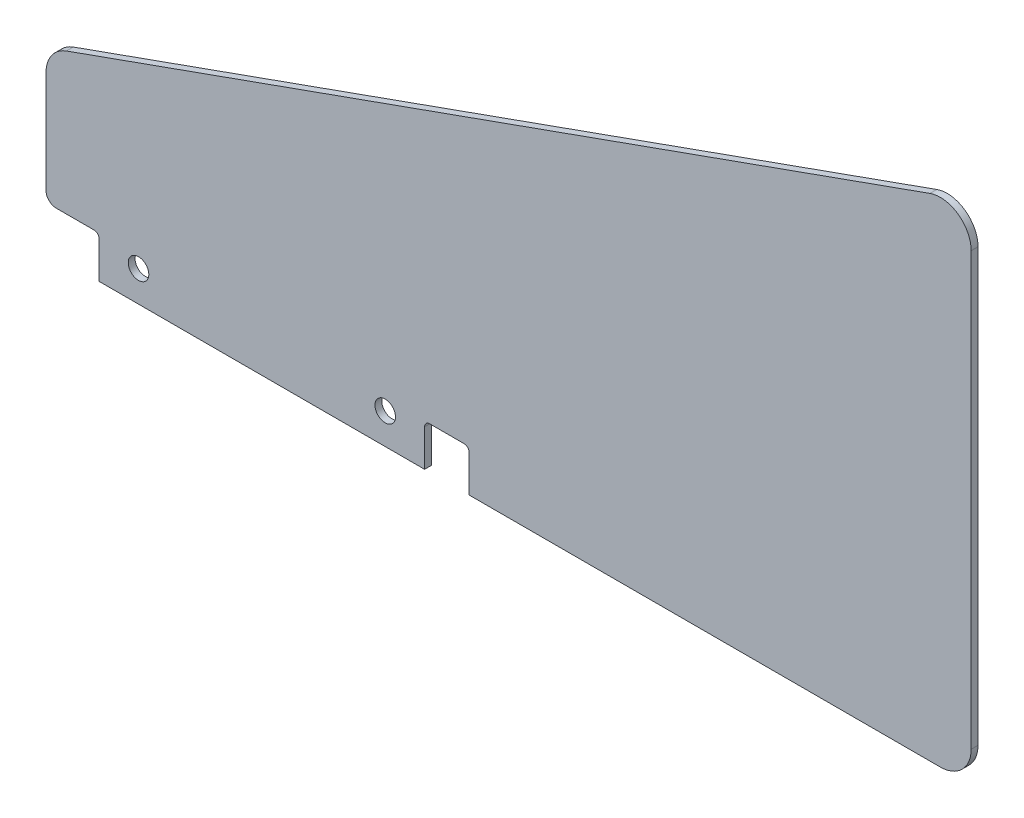
ISO-10303-21;
HEADER;
FILE_DESCRIPTION(('STEP AP214'),'2;1');
FILE_NAME('part.step','',(''),(''),'','','');
FILE_SCHEMA(('AUTOMOTIVE_DESIGN { 1 0 10303 214 1 1 1 1 }'));
ENDSEC;
DATA;
#1=APPLICATION_CONTEXT('core data for automotive mechanical design processes');
#2=APPLICATION_PROTOCOL_DEFINITION('international standard','automotive_design',2000,#1);
#3=PRODUCT_CONTEXT('',#1,'mechanical');
#4=PRODUCT('Part','Part','',(#3));
#5=PRODUCT_RELATED_PRODUCT_CATEGORY('part','',(#4));
#6=PRODUCT_DEFINITION_FORMATION('','',#4);
#7=PRODUCT_DEFINITION_CONTEXT('part definition',#1,'design');
#8=PRODUCT_DEFINITION('design','',#6,#7);
#9=PRODUCT_DEFINITION_SHAPE('','',#8);
#10=(LENGTH_UNIT() NAMED_UNIT(*) SI_UNIT(.MILLI.,.METRE.));
#11=(NAMED_UNIT(*) PLANE_ANGLE_UNIT() SI_UNIT($,.RADIAN.));
#12=(NAMED_UNIT(*) SI_UNIT($,.STERADIAN.) SOLID_ANGLE_UNIT());
#13=UNCERTAINTY_MEASURE_WITH_UNIT(LENGTH_MEASURE(1.E-05),#10,'distance_accuracy_value','');
#14=(GEOMETRIC_REPRESENTATION_CONTEXT(3) GLOBAL_UNCERTAINTY_ASSIGNED_CONTEXT((#13)) GLOBAL_UNIT_ASSIGNED_CONTEXT((#10,
#11,#12)) REPRESENTATION_CONTEXT('',''));
#15=CARTESIAN_POINT('',(0.,0.,0.));
#16=DIRECTION('',(0.,0.,1.));
#17=DIRECTION('',(1.,0.,0.));
#18=AXIS2_PLACEMENT_3D('',#15,#16,#17);
#19=CARTESIAN_POINT('',(216.1498900849,236.261881599726,1.));
#20=DIRECTION('',(0.,0.,1.));
#21=DIRECTION('',(1.,0.,0.));
#22=AXIS2_PLACEMENT_3D('',#19,#20,#21);
#23=PLANE('',#22);
#24=CARTESIAN_POINT('',(99.1498900849,173.2618815997,1.));
#25=DIRECTION('',(0.,0.,1.));
#26=DIRECTION('',(1.,0.,0.));
#27=AXIS2_PLACEMENT_3D('',#24,#25,#26);
#28=CIRCLE('',#27,1.5);
#29=CARTESIAN_POINT('',(100.6498900849,173.2618815997,1.));
#30=VERTEX_POINT('',#29);
#31=EDGE_CURVE('E188',#30,#30,#28,.T.);
#32=ORIENTED_EDGE('',*,*,#31,.F.);
#33=EDGE_LOOP('',(#32));
#34=FACE_BOUND('',#33,.T.);
#35=CARTESIAN_POINT('',(216.1498900849,236.261881599726,1.));
#36=DIRECTION('',(0.,0.,1.));
#37=DIRECTION('',(1.,0.,0.));
#38=AXIS2_PLACEMENT_3D('',#35,#36,#37);
#39=CIRCLE('',#38,4.5);
#40=CARTESIAN_POINT('',(220.6498900849,236.2618815997,1.));
#41=VERTEX_POINT('',#40);
#42=CARTESIAN_POINT('',(214.6363762984,240.4997202019,1.));
#43=VERTEX_POINT('',#42);
#44=EDGE_CURVE('E217',#41,#43,#39,.T.);
#45=ORIENTED_EDGE('',*,*,#44,.T.);
#46=DIRECTION('',(-0.941741911594838,-0.336336396998156,0.));
#47=VECTOR('',#46,1.);
#48=CARTESIAN_POINT('',(88.6363762984,195.4997202019,1.));
#49=LINE('',#48,#47);
#50=CARTESIAN_POINT('',(88.6363762984,195.4997202019,1.));
#51=VERTEX_POINT('',#50);
#52=EDGE_CURVE('E120',#43,#51,#49,.T.);
#53=ORIENTED_EDGE('',*,*,#52,.T.);
#54=CARTESIAN_POINT('',(90.1498900849,191.261881599726,1.));
#55=DIRECTION('',(0.,0.,1.));
#56=DIRECTION('',(1.,0.,0.));
#57=AXIS2_PLACEMENT_3D('',#54,#55,#56);
#58=CIRCLE('',#57,4.49999999999999);
#59=CARTESIAN_POINT('',(85.6498900849,191.2618815997,1.));
#60=VERTEX_POINT('',#59);
#61=EDGE_CURVE('E259',#51,#60,#58,.T.);
#62=ORIENTED_EDGE('',*,*,#61,.T.);
#63=DIRECTION('',(0.,-1.,0.));
#64=VECTOR('',#63,1.);
#65=CARTESIAN_POINT('',(85.6498900849,176.3868815997,1.));
#66=LINE('',#65,#64);
#67=CARTESIAN_POINT('',(85.6498900849,176.3868815997,1.));
#68=VERTEX_POINT('',#67);
#69=EDGE_CURVE('E278',#60,#68,#66,.T.);
#70=ORIENTED_EDGE('',*,*,#69,.T.);
#71=CARTESIAN_POINT('',(87.1498900849,176.3868815997,1.));
#72=DIRECTION('',(0.,0.,1.));
#73=DIRECTION('',(1.,0.,0.));
#74=AXIS2_PLACEMENT_3D('',#71,#72,#73);
#75=CIRCLE('',#74,1.5);
#76=CARTESIAN_POINT('',(87.1498900849,174.8868815997,1.));
#77=VERTEX_POINT('',#76);
#78=EDGE_CURVE('E275',#68,#77,#75,.T.);
#79=ORIENTED_EDGE('',*,*,#78,.T.);
#80=DIRECTION('',(1.,0.,0.));
#81=VECTOR('',#80,1.);
#82=CARTESIAN_POINT('',(87.1498900849,174.8868815997,1.));
#83=LINE('',#82,#81);
#84=CARTESIAN_POINT('',(92.6498900849,174.8868815997,1.));
#85=VERTEX_POINT('',#84);
#86=EDGE_CURVE('E277',#77,#85,#83,.T.);
#87=ORIENTED_EDGE('',*,*,#86,.T.);
#88=CARTESIAN_POINT('',(92.6498900849,174.1368815997,1.));
#89=DIRECTION('',(0.,0.,-1.));
#90=DIRECTION('',(1.,0.,0.));
#91=AXIS2_PLACEMENT_3D('',#88,#89,#90);
#92=CIRCLE('',#91,0.749999999999994);
#93=CARTESIAN_POINT('',(93.3998900849,174.1368815997,1.));
#94=VERTEX_POINT('',#93);
#95=EDGE_CURVE('E280',#85,#94,#92,.T.);
#96=ORIENTED_EDGE('',*,*,#95,.T.);
#97=DIRECTION('',(0.,-1.,0.));
#98=VECTOR('',#97,1.);
#99=CARTESIAN_POINT('',(93.3998900849,174.1368815997,1.));
#100=LINE('',#99,#98);
#101=CARTESIAN_POINT('',(93.3998900849,168.7618815997,1.));
#102=VERTEX_POINT('',#101);
#103=EDGE_CURVE('E286',#94,#102,#100,.T.);
#104=ORIENTED_EDGE('',*,*,#103,.T.);
#105=DIRECTION('',(1.,0.,0.));
#106=VECTOR('',#105,1.);
#107=CARTESIAN_POINT('',(93.3998900849,168.7618815997,1.));
#108=LINE('',#107,#106);
#109=CARTESIAN_POINT('',(140.8998900849,168.7618815997,1.));
#110=VERTEX_POINT('',#109);
#111=EDGE_CURVE('E288',#102,#110,#108,.T.);
#112=ORIENTED_EDGE('',*,*,#111,.T.);
#113=DIRECTION('',(0.,1.,0.));
#114=VECTOR('',#113,1.);
#115=CARTESIAN_POINT('',(140.8998900849,168.7618815997,1.));
#116=LINE('',#115,#114);
#117=CARTESIAN_POINT('',(140.8998900849,174.1368815997,1.));
#118=VERTEX_POINT('',#117);
#119=EDGE_CURVE('E290',#110,#118,#116,.T.);
#120=ORIENTED_EDGE('',*,*,#119,.T.);
#121=CARTESIAN_POINT('',(141.6498900849,174.1368815997,1.));
#122=DIRECTION('',(0.,0.,-1.));
#123=DIRECTION('',(1.,0.,0.));
#124=AXIS2_PLACEMENT_3D('',#121,#122,#123);
#125=CIRCLE('',#124,0.750000000000001);
#126=CARTESIAN_POINT('',(141.6498900849,174.8868815997,1.));
#127=VERTEX_POINT('',#126);
#128=EDGE_CURVE('E292',#118,#127,#125,.T.);
#129=ORIENTED_EDGE('',*,*,#128,.T.);
#130=DIRECTION('',(1.,0.,0.));
#131=VECTOR('',#130,1.);
#132=CARTESIAN_POINT('',(141.6498900849,174.8868815997,1.));
#133=LINE('',#132,#131);
#134=CARTESIAN_POINT('',(146.6498900849,174.8868815997,1.));
#135=VERTEX_POINT('',#134);
#136=EDGE_CURVE('E294',#127,#135,#133,.T.);
#137=ORIENTED_EDGE('',*,*,#136,.T.);
#138=CARTESIAN_POINT('',(146.6498900849,174.1368815997,1.));
#139=DIRECTION('',(0.,0.,-1.));
#140=DIRECTION('',(1.,0.,0.));
#141=AXIS2_PLACEMENT_3D('',#138,#139,#140);
#142=CIRCLE('',#141,0.750000000000001);
#143=CARTESIAN_POINT('',(147.3998900849,174.1368815997,1.));
#144=VERTEX_POINT('',#143);
#145=EDGE_CURVE('E296',#135,#144,#142,.T.);
#146=ORIENTED_EDGE('',*,*,#145,.T.);
#147=DIRECTION('',(0.,-1.,0.));
#148=VECTOR('',#147,1.);
#149=CARTESIAN_POINT('',(147.3998900849,174.1368815997,1.));
#150=LINE('',#149,#148);
#151=CARTESIAN_POINT('',(147.3998900849,168.7618815997,1.));
#152=VERTEX_POINT('',#151);
#153=EDGE_CURVE('E166',#144,#152,#150,.T.);
#154=ORIENTED_EDGE('',*,*,#153,.T.);
#155=DIRECTION('',(1.,0.,0.));
#156=VECTOR('',#155,1.);
#157=CARTESIAN_POINT('',(147.3998900849,168.7618815997,1.));
#158=LINE('',#157,#156);
#159=CARTESIAN_POINT('',(216.1498900849,168.7618815997,1.));
#160=VERTEX_POINT('',#159);
#161=EDGE_CURVE('E160',#152,#160,#158,.T.);
#162=ORIENTED_EDGE('',*,*,#161,.T.);
#163=CARTESIAN_POINT('',(216.1498900849,173.2618815997,1.));
#164=DIRECTION('',(0.,0.,1.));
#165=DIRECTION('',(1.,0.,0.));
#166=AXIS2_PLACEMENT_3D('',#163,#164,#165);
#167=CIRCLE('',#166,4.5);
#168=CARTESIAN_POINT('',(220.6498900849,173.2618815997,1.));
#169=VERTEX_POINT('',#168);
#170=EDGE_CURVE('E164',#160,#169,#167,.T.);
#171=ORIENTED_EDGE('',*,*,#170,.T.);
#172=DIRECTION('',(0.,1.,0.));
#173=VECTOR('',#172,1.);
#174=CARTESIAN_POINT('',(220.6498900849,236.2618815997,1.));
#175=LINE('',#174,#173);
#176=EDGE_CURVE('E50',#169,#41,#175,.T.);
#177=ORIENTED_EDGE('',*,*,#176,.T.);
#178=EDGE_LOOP('',(#45,#53,#62,#70,#79,#87,#96,#104,#112,#120,#129,#137,#146,#154,#162,#171,#177));
#179=FACE_BOUND('',#178,.T.);
#180=CARTESIAN_POINT('',(135.1498900849,173.2618815997,1.));
#181=DIRECTION('',(0.,0.,1.));
#182=DIRECTION('',(1.,0.,0.));
#183=AXIS2_PLACEMENT_3D('',#180,#181,#182);
#184=CIRCLE('',#183,1.5);
#185=CARTESIAN_POINT('',(136.6498900849,173.2618815997,1.));
#186=VERTEX_POINT('',#185);
#187=EDGE_CURVE('E339',#186,#186,#184,.T.);
#188=ORIENTED_EDGE('',*,*,#187,.F.);
#189=EDGE_LOOP('',(#188));
#190=FACE_BOUND('',#189,.T.);
#191=ADVANCED_FACE('F33',(#34,#179,#190),#23,.T.);
#192=CARTESIAN_POINT('',(216.1498900849,236.261881599726,0.));
#193=DIRECTION('',(0.,0.,1.));
#194=DIRECTION('',(1.,0.,0.));
#195=AXIS2_PLACEMENT_3D('',#192,#193,#194);
#196=PLANE('',#195);
#197=CARTESIAN_POINT('',(99.1498900849,173.2618815997,0.));
#198=DIRECTION('',(0.,0.,1.));
#199=DIRECTION('',(1.,0.,0.));
#200=AXIS2_PLACEMENT_3D('',#197,#198,#199);
#201=CIRCLE('',#200,1.5);
#202=CARTESIAN_POINT('',(100.6498900849,173.2618815997,0.));
#203=VERTEX_POINT('',#202);
#204=EDGE_CURVE('E344',#203,#203,#201,.T.);
#205=ORIENTED_EDGE('',*,*,#204,.T.);
#206=EDGE_LOOP('',(#205));
#207=FACE_BOUND('',#206,.T.);
#208=CARTESIAN_POINT('',(216.1498900849,236.261881599726,0.));
#209=DIRECTION('',(0.,0.,1.));
#210=DIRECTION('',(1.,0.,0.));
#211=AXIS2_PLACEMENT_3D('',#208,#209,#210);
#212=CIRCLE('',#211,4.5);
#213=CARTESIAN_POINT('',(220.6498900849,236.2618815997,0.));
#214=VERTEX_POINT('',#213);
#215=CARTESIAN_POINT('',(214.6363762984,240.4997202019,0.));
#216=VERTEX_POINT('',#215);
#217=EDGE_CURVE('E184',#214,#216,#212,.T.);
#218=ORIENTED_EDGE('',*,*,#217,.F.);
#219=DIRECTION('',(0.,1.,0.));
#220=VECTOR('',#219,1.);
#221=CARTESIAN_POINT('',(220.6498900849,236.2618815997,0.));
#222=LINE('',#221,#220);
#223=CARTESIAN_POINT('',(220.6498900849,173.2618815997,0.));
#224=VERTEX_POINT('',#223);
#225=EDGE_CURVE('E112',#224,#214,#222,.T.);
#226=ORIENTED_EDGE('',*,*,#225,.F.);
#227=CARTESIAN_POINT('',(216.1498900849,173.2618815997,0.));
#228=DIRECTION('',(0.,0.,1.));
#229=DIRECTION('',(1.,0.,0.));
#230=AXIS2_PLACEMENT_3D('',#227,#228,#229);
#231=CIRCLE('',#230,4.5);
#232=CARTESIAN_POINT('',(216.1498900849,168.7618815997,0.));
#233=VERTEX_POINT('',#232);
#234=EDGE_CURVE('E106',#233,#224,#231,.T.);
#235=ORIENTED_EDGE('',*,*,#234,.F.);
#236=DIRECTION('',(1.,0.,0.));
#237=VECTOR('',#236,1.);
#238=CARTESIAN_POINT('',(147.3998900849,168.7618815997,0.));
#239=LINE('',#238,#237);
#240=CARTESIAN_POINT('',(147.3998900849,168.7618815997,0.));
#241=VERTEX_POINT('',#240);
#242=EDGE_CURVE('E174',#241,#233,#239,.T.);
#243=ORIENTED_EDGE('',*,*,#242,.F.);
#244=DIRECTION('',(0.,-1.,0.));
#245=VECTOR('',#244,1.);
#246=CARTESIAN_POINT('',(147.3998900849,174.1368815997,0.));
#247=LINE('',#246,#245);
#248=CARTESIAN_POINT('',(147.3998900849,174.1368815997,0.));
#249=VERTEX_POINT('',#248);
#250=EDGE_CURVE('E212',#249,#241,#247,.T.);
#251=ORIENTED_EDGE('',*,*,#250,.F.);
#252=CARTESIAN_POINT('',(146.6498900849,174.1368815997,0.));
#253=DIRECTION('',(0.,0.,-1.));
#254=DIRECTION('',(1.,0.,0.));
#255=AXIS2_PLACEMENT_3D('',#252,#253,#254);
#256=CIRCLE('',#255,0.750000000000001);
#257=CARTESIAN_POINT('',(146.6498900849,174.8868815997,0.));
#258=VERTEX_POINT('',#257);
#259=EDGE_CURVE('E210',#258,#249,#256,.T.);
#260=ORIENTED_EDGE('',*,*,#259,.F.);
#261=DIRECTION('',(1.,0.,0.));
#262=VECTOR('',#261,1.);
#263=CARTESIAN_POINT('',(141.6498900849,174.8868815997,0.));
#264=LINE('',#263,#262);
#265=CARTESIAN_POINT('',(141.6498900849,174.8868815997,0.));
#266=VERTEX_POINT('',#265);
#267=EDGE_CURVE('E208',#266,#258,#264,.T.);
#268=ORIENTED_EDGE('',*,*,#267,.F.);
#269=CARTESIAN_POINT('',(141.6498900849,174.1368815997,0.));
#270=DIRECTION('',(0.,0.,-1.));
#271=DIRECTION('',(1.,0.,0.));
#272=AXIS2_PLACEMENT_3D('',#269,#270,#271);
#273=CIRCLE('',#272,0.750000000000001);
#274=CARTESIAN_POINT('',(140.8998900849,174.1368815997,0.));
#275=VERTEX_POINT('',#274);
#276=EDGE_CURVE('E206',#275,#266,#273,.T.);
#277=ORIENTED_EDGE('',*,*,#276,.F.);
#278=DIRECTION('',(0.,1.,0.));
#279=VECTOR('',#278,1.);
#280=CARTESIAN_POINT('',(140.8998900849,168.7618815997,0.));
#281=LINE('',#280,#279);
#282=CARTESIAN_POINT('',(140.8998900849,168.7618815997,0.));
#283=VERTEX_POINT('',#282);
#284=EDGE_CURVE('E204',#283,#275,#281,.T.);
#285=ORIENTED_EDGE('',*,*,#284,.F.);
#286=DIRECTION('',(1.,0.,0.));
#287=VECTOR('',#286,1.);
#288=CARTESIAN_POINT('',(93.3998900849,168.7618815997,0.));
#289=LINE('',#288,#287);
#290=CARTESIAN_POINT('',(93.3998900849,168.7618815997,0.));
#291=VERTEX_POINT('',#290);
#292=EDGE_CURVE('E202',#291,#283,#289,.T.);
#293=ORIENTED_EDGE('',*,*,#292,.F.);
#294=DIRECTION('',(0.,-1.,0.));
#295=VECTOR('',#294,1.);
#296=CARTESIAN_POINT('',(93.3998900849,174.1368815997,0.));
#297=LINE('',#296,#295);
#298=CARTESIAN_POINT('',(93.3998900849,174.1368815997,0.));
#299=VERTEX_POINT('',#298);
#300=EDGE_CURVE('E200',#299,#291,#297,.T.);
#301=ORIENTED_EDGE('',*,*,#300,.F.);
#302=CARTESIAN_POINT('',(92.6498900849,174.1368815997,0.));
#303=DIRECTION('',(0.,0.,-1.));
#304=DIRECTION('',(1.,0.,0.));
#305=AXIS2_PLACEMENT_3D('',#302,#303,#304);
#306=CIRCLE('',#305,0.749999999999994);
#307=CARTESIAN_POINT('',(92.6498900849,174.8868815997,0.));
#308=VERTEX_POINT('',#307);
#309=EDGE_CURVE('E198',#308,#299,#306,.T.);
#310=ORIENTED_EDGE('',*,*,#309,.F.);
#311=DIRECTION('',(1.,0.,0.));
#312=VECTOR('',#311,1.);
#313=CARTESIAN_POINT('',(87.1498900849,174.8868815997,0.));
#314=LINE('',#313,#312);
#315=CARTESIAN_POINT('',(87.1498900849,174.8868815997,0.));
#316=VERTEX_POINT('',#315);
#317=EDGE_CURVE('E196',#316,#308,#314,.T.);
#318=ORIENTED_EDGE('',*,*,#317,.F.);
#319=CARTESIAN_POINT('',(87.1498900849,176.3868815997,0.));
#320=DIRECTION('',(0.,0.,1.));
#321=DIRECTION('',(1.,0.,0.));
#322=AXIS2_PLACEMENT_3D('',#319,#320,#321);
#323=CIRCLE('',#322,1.5);
#324=CARTESIAN_POINT('',(85.6498900849,176.3868815997,0.));
#325=VERTEX_POINT('',#324);
#326=EDGE_CURVE('E194',#325,#316,#323,.T.);
#327=ORIENTED_EDGE('',*,*,#326,.F.);
#328=DIRECTION('',(0.,-1.,0.));
#329=VECTOR('',#328,1.);
#330=CARTESIAN_POINT('',(85.6498900849,176.3868815997,0.));
#331=LINE('',#330,#329);
#332=CARTESIAN_POINT('',(85.6498900849,191.2618815997,0.));
#333=VERTEX_POINT('',#332);
#334=EDGE_CURVE('E192',#333,#325,#331,.T.);
#335=ORIENTED_EDGE('',*,*,#334,.F.);
#336=CARTESIAN_POINT('',(90.1498900849,191.261881599726,0.));
#337=DIRECTION('',(0.,0.,1.));
#338=DIRECTION('',(1.,0.,0.));
#339=AXIS2_PLACEMENT_3D('',#336,#337,#338);
#340=CIRCLE('',#339,4.49999999999999);
#341=CARTESIAN_POINT('',(88.6363762984,195.4997202019,0.));
#342=VERTEX_POINT('',#341);
#343=EDGE_CURVE('E190',#342,#333,#340,.T.);
#344=ORIENTED_EDGE('',*,*,#343,.F.);
#345=DIRECTION('',(-0.941741911594838,-0.336336396998156,0.));
#346=VECTOR('',#345,1.);
#347=CARTESIAN_POINT('',(88.6363762984,195.4997202019,0.));
#348=LINE('',#347,#346);
#349=EDGE_CURVE('E187',#216,#342,#348,.T.);
#350=ORIENTED_EDGE('',*,*,#349,.F.);
#351=EDGE_LOOP('',(#218,#226,#235,#243,#251,#260,#268,#277,#285,#293,#301,#310,#318,#327,#335,
#344,#350));
#352=FACE_BOUND('',#351,.T.);
#353=CARTESIAN_POINT('',(135.1498900849,173.2618815997,0.));
#354=DIRECTION('',(0.,0.,1.));
#355=DIRECTION('',(1.,0.,0.));
#356=AXIS2_PLACEMENT_3D('',#353,#354,#355);
#357=CIRCLE('',#356,1.5);
#358=CARTESIAN_POINT('',(136.6498900849,173.2618815997,0.));
#359=VERTEX_POINT('',#358);
#360=EDGE_CURVE('E342',#359,#359,#357,.T.);
#361=ORIENTED_EDGE('',*,*,#360,.T.);
#362=EDGE_LOOP('',(#361));
#363=FACE_BOUND('',#362,.T.);
#364=ADVANCED_FACE('F263',(#207,#352,#363),#196,.F.);
#365=CARTESIAN_POINT('',(216.1498900849,236.261881599726,1.));
#366=DIRECTION('',(0.,0.,-1.));
#367=DIRECTION('',(-1.,0.,0.));
#368=AXIS2_PLACEMENT_3D('',#365,#366,#367);
#369=CYLINDRICAL_SURFACE('',#368,4.5);
#370=ORIENTED_EDGE('',*,*,#217,.T.);
#371=DIRECTION('',(0.,0.,-1.));
#372=VECTOR('',#371,1.);
#373=CARTESIAN_POINT('',(214.6363762984,240.4997202019,1.));
#374=LINE('',#373,#372);
#375=EDGE_CURVE('E11',#43,#216,#374,.T.);
#376=ORIENTED_EDGE('',*,*,#375,.F.);
#377=ORIENTED_EDGE('',*,*,#44,.F.);
#378=DIRECTION('',(0.,0.,-1.));
#379=VECTOR('',#378,1.);
#380=CARTESIAN_POINT('',(220.6498900849,236.2618815997,1.));
#381=LINE('',#380,#379);
#382=EDGE_CURVE('E180',#41,#214,#381,.T.);
#383=ORIENTED_EDGE('',*,*,#382,.T.);
#384=EDGE_LOOP('',(#370,#376,#377,#383));
#385=FACE_BOUND('',#384,.T.);
#386=ADVANCED_FACE('F35',(#385),#369,.T.);
#387=CARTESIAN_POINT('',(88.6363762984,195.4997202019,1.));
#388=DIRECTION('',(0.336336396998156,-0.941741911594838,0.));
#389=DIRECTION('',(0.941741911594838,0.336336396998156,0.));
#390=AXIS2_PLACEMENT_3D('',#387,#388,#389);
#391=PLANE('',#390);
#392=ORIENTED_EDGE('',*,*,#349,.T.);
#393=DIRECTION('',(0.,0.,-1.));
#394=VECTOR('',#393,1.);
#395=CARTESIAN_POINT('',(88.6363762984,195.4997202019,1.));
#396=LINE('',#395,#394);
#397=EDGE_CURVE('E42',#51,#342,#396,.T.);
#398=ORIENTED_EDGE('',*,*,#397,.F.);
#399=ORIENTED_EDGE('',*,*,#52,.F.);
#400=ORIENTED_EDGE('',*,*,#375,.T.);
#401=EDGE_LOOP('',(#392,#398,#399,#400));
#402=FACE_BOUND('',#401,.T.);
#403=ADVANCED_FACE('F487',(#402),#391,.F.);
#404=CARTESIAN_POINT('',(90.1498900849,191.261881599726,1.));
#405=DIRECTION('',(0.,0.,-1.));
#406=DIRECTION('',(-1.,0.,0.));
#407=AXIS2_PLACEMENT_3D('',#404,#405,#406);
#408=CYLINDRICAL_SURFACE('',#407,4.49999999999999);
#409=ORIENTED_EDGE('',*,*,#343,.T.);
#410=DIRECTION('',(0.,0.,-1.));
#411=VECTOR('',#410,1.);
#412=CARTESIAN_POINT('',(85.6498900849,191.2618815997,1.));
#413=LINE('',#412,#411);
#414=EDGE_CURVE('E251',#60,#333,#413,.T.);
#415=ORIENTED_EDGE('',*,*,#414,.F.);
#416=ORIENTED_EDGE('',*,*,#61,.F.);
#417=ORIENTED_EDGE('',*,*,#397,.T.);
#418=EDGE_LOOP('',(#409,#415,#416,#417));
#419=FACE_BOUND('',#418,.T.);
#420=ADVANCED_FACE('F257',(#419),#408,.T.);
#421=CARTESIAN_POINT('',(85.6498900849,176.3868815997,1.));
#422=DIRECTION('',(1.,0.,0.));
#423=DIRECTION('',(0.,0.,-1.));
#424=AXIS2_PLACEMENT_3D('',#421,#422,#423);
#425=PLANE('',#424);
#426=ORIENTED_EDGE('',*,*,#334,.T.);
#427=DIRECTION('',(0.,0.,-1.));
#428=VECTOR('',#427,1.);
#429=CARTESIAN_POINT('',(85.6498900849,176.3868815997,1.));
#430=LINE('',#429,#428);
#431=EDGE_CURVE('E248',#68,#325,#430,.T.);
#432=ORIENTED_EDGE('',*,*,#431,.F.);
#433=ORIENTED_EDGE('',*,*,#69,.F.);
#434=ORIENTED_EDGE('',*,*,#414,.T.);
#435=EDGE_LOOP('',(#426,#432,#433,#434));
#436=FACE_BOUND('',#435,.T.);
#437=ADVANCED_FACE('F269',(#436),#425,.F.);
#438=CARTESIAN_POINT('',(87.1498900849,176.3868815997,1.));
#439=DIRECTION('',(0.,0.,-1.));
#440=DIRECTION('',(-1.,0.,0.));
#441=AXIS2_PLACEMENT_3D('',#438,#439,#440);
#442=CYLINDRICAL_SURFACE('',#441,1.5);
#443=ORIENTED_EDGE('',*,*,#326,.T.);
#444=DIRECTION('',(0.,0.,-1.));
#445=VECTOR('',#444,1.);
#446=CARTESIAN_POINT('',(87.1498900849,174.8868815997,1.));
#447=LINE('',#446,#445);
#448=EDGE_CURVE('E245',#77,#316,#447,.T.);
#449=ORIENTED_EDGE('',*,*,#448,.F.);
#450=ORIENTED_EDGE('',*,*,#78,.F.);
#451=ORIENTED_EDGE('',*,*,#431,.T.);
#452=EDGE_LOOP('',(#443,#449,#450,#451));
#453=FACE_BOUND('',#452,.T.);
#454=ADVANCED_FACE('F273',(#453),#442,.T.);
#455=CARTESIAN_POINT('',(87.1498900849,174.8868815997,1.));
#456=DIRECTION('',(0.,1.,0.));
#457=DIRECTION('',(0.,0.,1.));
#458=AXIS2_PLACEMENT_3D('',#455,#456,#457);
#459=PLANE('',#458);
#460=ORIENTED_EDGE('',*,*,#317,.T.);
#461=DIRECTION('',(0.,0.,-1.));
#462=VECTOR('',#461,1.);
#463=CARTESIAN_POINT('',(92.6498900849,174.8868815997,1.));
#464=LINE('',#463,#462);
#465=EDGE_CURVE('E242',#85,#308,#464,.T.);
#466=ORIENTED_EDGE('',*,*,#465,.F.);
#467=ORIENTED_EDGE('',*,*,#86,.F.);
#468=ORIENTED_EDGE('',*,*,#448,.T.);
#469=EDGE_LOOP('',(#460,#466,#467,#468));
#470=FACE_BOUND('',#469,.T.);
#471=ADVANCED_FACE('F452',(#470),#459,.F.);
#472=CARTESIAN_POINT('',(92.6498900849,174.1368815997,1.));
#473=DIRECTION('',(0.,0.,-1.));
#474=DIRECTION('',(-1.,0.,0.));
#475=AXIS2_PLACEMENT_3D('',#472,#473,#474);
#476=CYLINDRICAL_SURFACE('',#475,0.749999999999994);
#477=ORIENTED_EDGE('',*,*,#309,.T.);
#478=DIRECTION('',(0.,0.,-1.));
#479=VECTOR('',#478,1.);
#480=CARTESIAN_POINT('',(93.3998900849,174.1368815997,1.));
#481=LINE('',#480,#479);
#482=EDGE_CURVE('E239',#94,#299,#481,.T.);
#483=ORIENTED_EDGE('',*,*,#482,.F.);
#484=ORIENTED_EDGE('',*,*,#95,.F.);
#485=ORIENTED_EDGE('',*,*,#465,.T.);
#486=EDGE_LOOP('',(#477,#483,#484,#485));
#487=FACE_BOUND('',#486,.T.);
#488=ADVANCED_FACE('F442',(#487),#476,.F.);
#489=CARTESIAN_POINT('',(93.3998900849,174.1368815997,1.));
#490=DIRECTION('',(1.,0.,0.));
#491=DIRECTION('',(0.,0.,-1.));
#492=AXIS2_PLACEMENT_3D('',#489,#490,#491);
#493=PLANE('',#492);
#494=ORIENTED_EDGE('',*,*,#300,.T.);
#495=DIRECTION('',(0.,0.,-1.));
#496=VECTOR('',#495,1.);
#497=CARTESIAN_POINT('',(93.3998900849,168.7618815997,1.));
#498=LINE('',#497,#496);
#499=EDGE_CURVE('E236',#102,#291,#498,.T.);
#500=ORIENTED_EDGE('',*,*,#499,.F.);
#501=ORIENTED_EDGE('',*,*,#103,.F.);
#502=ORIENTED_EDGE('',*,*,#482,.T.);
#503=EDGE_LOOP('',(#494,#500,#501,#502));
#504=FACE_BOUND('',#503,.T.);
#505=ADVANCED_FACE('F432',(#504),#493,.F.);
#506=CARTESIAN_POINT('',(93.3998900849,168.7618815997,1.));
#507=DIRECTION('',(0.,1.,0.));
#508=DIRECTION('',(0.,0.,1.));
#509=AXIS2_PLACEMENT_3D('',#506,#507,#508);
#510=PLANE('',#509);
#511=ORIENTED_EDGE('',*,*,#292,.T.);
#512=DIRECTION('',(0.,0.,-1.));
#513=VECTOR('',#512,1.);
#514=CARTESIAN_POINT('',(140.8998900849,168.7618815997,1.));
#515=LINE('',#514,#513);
#516=EDGE_CURVE('E233',#110,#283,#515,.T.);
#517=ORIENTED_EDGE('',*,*,#516,.F.);
#518=ORIENTED_EDGE('',*,*,#111,.F.);
#519=ORIENTED_EDGE('',*,*,#499,.T.);
#520=EDGE_LOOP('',(#511,#517,#518,#519));
#521=FACE_BOUND('',#520,.T.);
#522=ADVANCED_FACE('F422',(#521),#510,.F.);
#523=CARTESIAN_POINT('',(140.8998900849,168.7618815997,1.));
#524=DIRECTION('',(-1.,0.,0.));
#525=DIRECTION('',(0.,0.,1.));
#526=AXIS2_PLACEMENT_3D('',#523,#524,#525);
#527=PLANE('',#526);
#528=ORIENTED_EDGE('',*,*,#284,.T.);
#529=DIRECTION('',(0.,0.,-1.));
#530=VECTOR('',#529,1.);
#531=CARTESIAN_POINT('',(140.8998900849,174.1368815997,1.));
#532=LINE('',#531,#530);
#533=EDGE_CURVE('E230',#118,#275,#532,.T.);
#534=ORIENTED_EDGE('',*,*,#533,.F.);
#535=ORIENTED_EDGE('',*,*,#119,.F.);
#536=ORIENTED_EDGE('',*,*,#516,.T.);
#537=EDGE_LOOP('',(#528,#534,#535,#536));
#538=FACE_BOUND('',#537,.T.);
#539=ADVANCED_FACE('F412',(#538),#527,.F.);
#540=CARTESIAN_POINT('',(141.6498900849,174.1368815997,1.));
#541=DIRECTION('',(0.,0.,-1.));
#542=DIRECTION('',(-1.,0.,0.));
#543=AXIS2_PLACEMENT_3D('',#540,#541,#542);
#544=CYLINDRICAL_SURFACE('',#543,0.750000000000001);
#545=ORIENTED_EDGE('',*,*,#276,.T.);
#546=DIRECTION('',(0.,0.,-1.));
#547=VECTOR('',#546,1.);
#548=CARTESIAN_POINT('',(141.6498900849,174.8868815997,1.));
#549=LINE('',#548,#547);
#550=EDGE_CURVE('E227',#127,#266,#549,.T.);
#551=ORIENTED_EDGE('',*,*,#550,.F.);
#552=ORIENTED_EDGE('',*,*,#128,.F.);
#553=ORIENTED_EDGE('',*,*,#533,.T.);
#554=EDGE_LOOP('',(#545,#551,#552,#553));
#555=FACE_BOUND('',#554,.T.);
#556=ADVANCED_FACE('F402',(#555),#544,.F.);
#557=CARTESIAN_POINT('',(141.6498900849,174.8868815997,1.));
#558=DIRECTION('',(0.,1.,0.));
#559=DIRECTION('',(0.,0.,1.));
#560=AXIS2_PLACEMENT_3D('',#557,#558,#559);
#561=PLANE('',#560);
#562=ORIENTED_EDGE('',*,*,#267,.T.);
#563=DIRECTION('',(0.,0.,-1.));
#564=VECTOR('',#563,1.);
#565=CARTESIAN_POINT('',(146.6498900849,174.8868815997,1.));
#566=LINE('',#565,#564);
#567=EDGE_CURVE('E224',#135,#258,#566,.T.);
#568=ORIENTED_EDGE('',*,*,#567,.F.);
#569=ORIENTED_EDGE('',*,*,#136,.F.);
#570=ORIENTED_EDGE('',*,*,#550,.T.);
#571=EDGE_LOOP('',(#562,#568,#569,#570));
#572=FACE_BOUND('',#571,.T.);
#573=ADVANCED_FACE('F393',(#572),#561,.F.);
#574=CARTESIAN_POINT('',(146.6498900849,174.1368815997,1.));
#575=DIRECTION('',(0.,0.,-1.));
#576=DIRECTION('',(-1.,0.,0.));
#577=AXIS2_PLACEMENT_3D('',#574,#575,#576);
#578=CYLINDRICAL_SURFACE('',#577,0.750000000000001);
#579=ORIENTED_EDGE('',*,*,#259,.T.);
#580=DIRECTION('',(0.,0.,-1.));
#581=VECTOR('',#580,1.);
#582=CARTESIAN_POINT('',(147.3998900849,174.1368815997,1.));
#583=LINE('',#582,#581);
#584=EDGE_CURVE('E221',#144,#249,#583,.T.);
#585=ORIENTED_EDGE('',*,*,#584,.F.);
#586=ORIENTED_EDGE('',*,*,#145,.F.);
#587=ORIENTED_EDGE('',*,*,#567,.T.);
#588=EDGE_LOOP('',(#579,#585,#586,#587));
#589=FACE_BOUND('',#588,.T.);
#590=ADVANCED_FACE('F302',(#589),#578,.F.);
#591=CARTESIAN_POINT('',(147.3998900849,174.1368815997,1.));
#592=DIRECTION('',(1.,0.,0.));
#593=DIRECTION('',(0.,0.,-1.));
#594=AXIS2_PLACEMENT_3D('',#591,#592,#593);
#595=PLANE('',#594);
#596=ORIENTED_EDGE('',*,*,#250,.T.);
#597=DIRECTION('',(0.,0.,-1.));
#598=VECTOR('',#597,1.);
#599=CARTESIAN_POINT('',(147.3998900849,168.7618815997,1.));
#600=LINE('',#599,#598);
#601=EDGE_CURVE('E175',#152,#241,#600,.T.);
#602=ORIENTED_EDGE('',*,*,#601,.F.);
#603=ORIENTED_EDGE('',*,*,#153,.F.);
#604=ORIENTED_EDGE('',*,*,#584,.T.);
#605=EDGE_LOOP('',(#596,#602,#603,#604));
#606=FACE_BOUND('',#605,.T.);
#607=ADVANCED_FACE('F306',(#606),#595,.F.);
#608=CARTESIAN_POINT('',(147.3998900849,168.7618815997,1.));
#609=DIRECTION('',(0.,1.,0.));
#610=DIRECTION('',(0.,0.,1.));
#611=AXIS2_PLACEMENT_3D('',#608,#609,#610);
#612=PLANE('',#611);
#613=ORIENTED_EDGE('',*,*,#242,.T.);
#614=DIRECTION('',(0.,0.,-1.));
#615=VECTOR('',#614,1.);
#616=CARTESIAN_POINT('',(216.1498900849,168.7618815997,1.));
#617=LINE('',#616,#615);
#618=EDGE_CURVE('E171',#160,#233,#617,.T.);
#619=ORIENTED_EDGE('',*,*,#618,.F.);
#620=ORIENTED_EDGE('',*,*,#161,.F.);
#621=ORIENTED_EDGE('',*,*,#601,.T.);
#622=EDGE_LOOP('',(#613,#619,#620,#621));
#623=FACE_BOUND('',#622,.T.);
#624=ADVANCED_FACE('F172',(#623),#612,.F.);
#625=CARTESIAN_POINT('',(216.1498900849,173.2618815997,1.));
#626=DIRECTION('',(0.,0.,-1.));
#627=DIRECTION('',(-1.,0.,0.));
#628=AXIS2_PLACEMENT_3D('',#625,#626,#627);
#629=CYLINDRICAL_SURFACE('',#628,4.5);
#630=ORIENTED_EDGE('',*,*,#234,.T.);
#631=DIRECTION('',(0.,0.,-1.));
#632=VECTOR('',#631,1.);
#633=CARTESIAN_POINT('',(220.6498900849,173.2618815997,1.));
#634=LINE('',#633,#632);
#635=EDGE_CURVE('E176',#169,#224,#634,.T.);
#636=ORIENTED_EDGE('',*,*,#635,.F.);
#637=ORIENTED_EDGE('',*,*,#170,.F.);
#638=ORIENTED_EDGE('',*,*,#618,.T.);
#639=EDGE_LOOP('',(#630,#636,#637,#638));
#640=FACE_BOUND('',#639,.T.);
#641=ADVANCED_FACE('F178',(#640),#629,.T.);
#642=CARTESIAN_POINT('',(220.6498900849,236.2618815997,1.));
#643=DIRECTION('',(-1.,0.,0.));
#644=DIRECTION('',(0.,0.,1.));
#645=AXIS2_PLACEMENT_3D('',#642,#643,#644);
#646=PLANE('',#645);
#647=ORIENTED_EDGE('',*,*,#225,.T.);
#648=ORIENTED_EDGE('',*,*,#382,.F.);
#649=ORIENTED_EDGE('',*,*,#176,.F.);
#650=ORIENTED_EDGE('',*,*,#635,.T.);
#651=EDGE_LOOP('',(#647,#648,#649,#650));
#652=FACE_BOUND('',#651,.T.);
#653=ADVANCED_FACE('F310',(#652),#646,.F.);
#654=CARTESIAN_POINT('',(99.1498900849,173.2618815997,1.));
#655=DIRECTION('',(0.,0.,-1.));
#656=DIRECTION('',(-1.,0.,0.));
#657=AXIS2_PLACEMENT_3D('',#654,#655,#656);
#658=CYLINDRICAL_SURFACE('',#657,1.5);
#659=ORIENTED_EDGE('',*,*,#31,.T.);
#660=EDGE_LOOP('',(#659));
#661=FACE_BOUND('',#660,.T.);
#662=ORIENTED_EDGE('',*,*,#204,.F.);
#663=EDGE_LOOP('',(#662));
#664=FACE_BOUND('',#663,.T.);
#665=ADVANCED_FACE('F312',(#661,#664),#658,.F.);
#666=CARTESIAN_POINT('',(135.1498900849,173.2618815997,1.));
#667=DIRECTION('',(0.,0.,-1.));
#668=DIRECTION('',(-1.,0.,0.));
#669=AXIS2_PLACEMENT_3D('',#666,#667,#668);
#670=CYLINDRICAL_SURFACE('',#669,1.5);
#671=ORIENTED_EDGE('',*,*,#187,.T.);
#672=EDGE_LOOP('',(#671));
#673=FACE_BOUND('',#672,.T.);
#674=ORIENTED_EDGE('',*,*,#360,.F.);
#675=EDGE_LOOP('',(#674));
#676=FACE_BOUND('',#675,.T.);
#677=ADVANCED_FACE('F318',(#673,#676),#670,.F.);
#678=CLOSED_SHELL('',(#191,#364,#386,#403,#420,#437,#454,#471,#488,#505,#522,#539,#556,#573,
#590,#607,#624,#641,#653,#665,#677));
#679=MANIFOLD_SOLID_BREP('B2',#678);
#680=ADVANCED_BREP_SHAPE_REPRESENTATION('',(#18,#679),#14);
#681=SHAPE_DEFINITION_REPRESENTATION(#9,#680);
ENDSEC;
END-ISO-10303-21;
